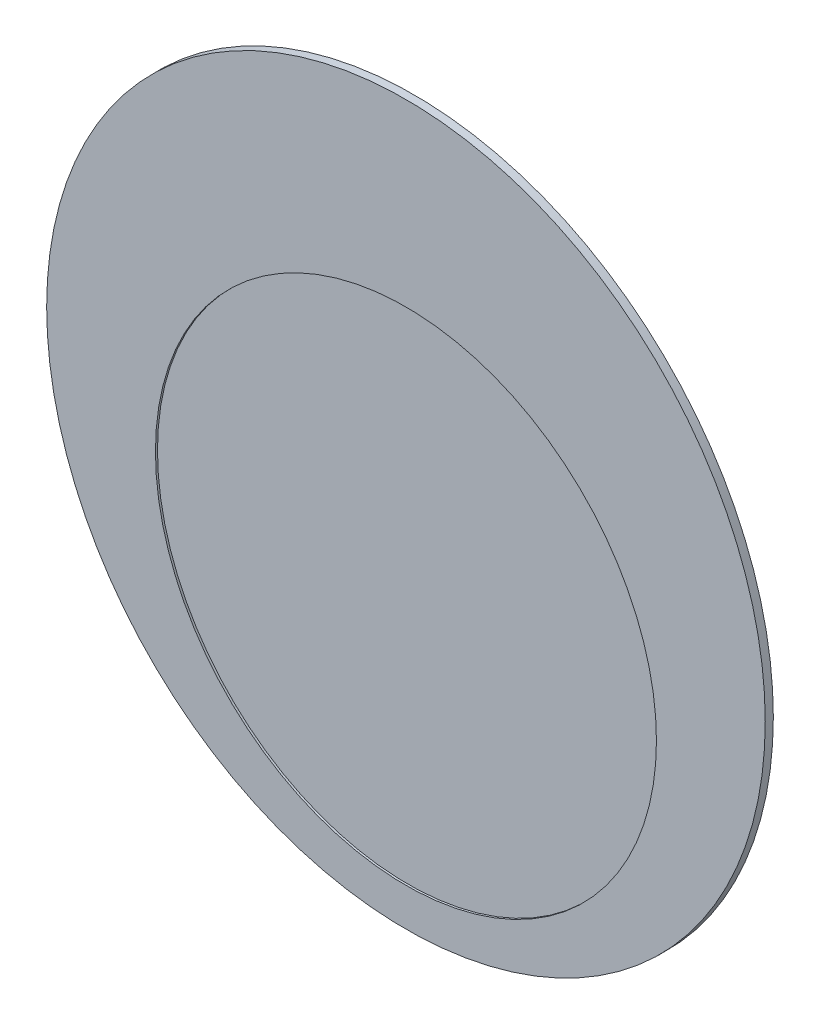
ISO-10303-21;
HEADER;
FILE_DESCRIPTION(('STEP AP214'),'2;1');
FILE_NAME('part.step','',(''),(''),'','','');
FILE_SCHEMA(('AUTOMOTIVE_DESIGN { 1 0 10303 214 1 1 1 1 }'));
ENDSEC;
DATA;
#1=APPLICATION_CONTEXT('core data for automotive mechanical design processes');
#2=APPLICATION_PROTOCOL_DEFINITION('international standard','automotive_design',2000,#1);
#3=PRODUCT_CONTEXT('',#1,'mechanical');
#4=PRODUCT('Part','Part','',(#3));
#5=PRODUCT_RELATED_PRODUCT_CATEGORY('part','',(#4));
#6=PRODUCT_DEFINITION_FORMATION('','',#4);
#7=PRODUCT_DEFINITION_CONTEXT('part definition',#1,'design');
#8=PRODUCT_DEFINITION('design','',#6,#7);
#9=PRODUCT_DEFINITION_SHAPE('','',#8);
#10=(LENGTH_UNIT() NAMED_UNIT(*) SI_UNIT(.MILLI.,.METRE.));
#11=(NAMED_UNIT(*) PLANE_ANGLE_UNIT() SI_UNIT($,.RADIAN.));
#12=(NAMED_UNIT(*) SI_UNIT($,.STERADIAN.) SOLID_ANGLE_UNIT());
#13=UNCERTAINTY_MEASURE_WITH_UNIT(LENGTH_MEASURE(1.E-05),#10,'distance_accuracy_value','');
#14=(GEOMETRIC_REPRESENTATION_CONTEXT(3) GLOBAL_UNCERTAINTY_ASSIGNED_CONTEXT((#13)) GLOBAL_UNIT_ASSIGNED_CONTEXT((#10,
#11,#12)) REPRESENTATION_CONTEXT('',''));
#15=CARTESIAN_POINT('',(0.,0.,0.));
#16=DIRECTION('',(0.,0.,1.));
#17=DIRECTION('',(1.,0.,0.));
#18=AXIS2_PLACEMENT_3D('',#15,#16,#17);
#19=CARTESIAN_POINT('',(0.,0.,0.8));
#20=DIRECTION('',(0.,0.,-1.));
#21=DIRECTION('',(-1.,0.,0.));
#22=AXIS2_PLACEMENT_3D('',#19,#20,#21);
#23=CYLINDRICAL_SURFACE('',#22,35.5);
#24=CARTESIAN_POINT('',(0.,0.,0.8));
#25=DIRECTION('',(0.,0.,1.));
#26=DIRECTION('',(1.,0.,0.));
#27=AXIS2_PLACEMENT_3D('',#24,#25,#26);
#28=CIRCLE('',#27,35.5);
#29=CARTESIAN_POINT('',(35.5,0.,0.8));
#30=VERTEX_POINT('',#29);
#31=EDGE_CURVE('E10',#30,#30,#28,.T.);
#32=ORIENTED_EDGE('',*,*,#31,.F.);
#33=EDGE_LOOP('',(#32));
#34=FACE_BOUND('',#33,.T.);
#35=CARTESIAN_POINT('',(0.,0.,0.));
#36=DIRECTION('',(0.,0.,1.));
#37=DIRECTION('',(1.,0.,0.));
#38=AXIS2_PLACEMENT_3D('',#35,#36,#37);
#39=CIRCLE('',#38,35.5);
#40=CARTESIAN_POINT('',(35.5,0.,0.));
#41=VERTEX_POINT('',#40);
#42=EDGE_CURVE('E40',#41,#41,#39,.T.);
#43=ORIENTED_EDGE('',*,*,#42,.T.);
#44=EDGE_LOOP('',(#43));
#45=FACE_BOUND('',#44,.T.);
#46=ADVANCED_FACE('F37',(#34,#45),#23,.T.);
#47=CARTESIAN_POINT('',(0.,0.,0.8));
#48=DIRECTION('',(0.,0.,1.));
#49=DIRECTION('',(1.,0.,0.));
#50=AXIS2_PLACEMENT_3D('',#47,#48,#49);
#51=PLANE('',#50);
#52=CARTESIAN_POINT('',(0.,-7.,0.8));
#53=DIRECTION('',(0.,0.,1.));
#54=DIRECTION('',(1.,0.,0.));
#55=AXIS2_PLACEMENT_3D('',#52,#53,#54);
#56=CIRCLE('',#55,24.75);
#57=CARTESIAN_POINT('',(24.75,-7.,0.8));
#58=VERTEX_POINT('',#57);
#59=EDGE_CURVE('E51',#58,#58,#56,.T.);
#60=ORIENTED_EDGE('',*,*,#59,.F.);
#61=EDGE_LOOP('',(#60));
#62=FACE_BOUND('',#61,.T.);
#63=ORIENTED_EDGE('',*,*,#31,.T.);
#64=EDGE_LOOP('',(#63));
#65=FACE_BOUND('',#64,.T.);
#66=ADVANCED_FACE('F68',(#62,#65),#51,.T.);
#67=CARTESIAN_POINT('',(0.,0.,0.));
#68=DIRECTION('',(0.,0.,1.));
#69=DIRECTION('',(1.,0.,0.));
#70=AXIS2_PLACEMENT_3D('',#67,#68,#69);
#71=PLANE('',#70);
#72=ORIENTED_EDGE('',*,*,#42,.F.);
#73=EDGE_LOOP('',(#72));
#74=FACE_BOUND('',#73,.T.);
#75=ADVANCED_FACE('F64',(#74),#71,.F.);
#76=CARTESIAN_POINT('',(0.,-7.,0.6));
#77=DIRECTION('',(0.,0.,1.));
#78=DIRECTION('',(1.,0.,0.));
#79=AXIS2_PLACEMENT_3D('',#76,#77,#78);
#80=CYLINDRICAL_SURFACE('',#79,24.75);
#81=CARTESIAN_POINT('',(0.,-7.,0.6));
#82=DIRECTION('',(0.,0.,1.));
#83=DIRECTION('',(1.,0.,0.));
#84=AXIS2_PLACEMENT_3D('',#81,#82,#83);
#85=CIRCLE('',#84,24.75);
#86=CARTESIAN_POINT('',(24.75,-7.,0.6));
#87=VERTEX_POINT('',#86);
#88=EDGE_CURVE('E49',#87,#87,#85,.T.);
#89=ORIENTED_EDGE('',*,*,#88,.F.);
#90=EDGE_LOOP('',(#89));
#91=FACE_BOUND('',#90,.T.);
#92=ORIENTED_EDGE('',*,*,#59,.T.);
#93=EDGE_LOOP('',(#92));
#94=FACE_BOUND('',#93,.T.);
#95=ADVANCED_FACE('F61',(#91,#94),#80,.F.);
#96=CARTESIAN_POINT('',(0.,-7.,0.6));
#97=DIRECTION('',(0.,0.,1.));
#98=DIRECTION('',(1.,0.,0.));
#99=AXIS2_PLACEMENT_3D('',#96,#97,#98);
#100=PLANE('',#99);
#101=ORIENTED_EDGE('',*,*,#88,.T.);
#102=EDGE_LOOP('',(#101));
#103=FACE_BOUND('',#102,.T.);
#104=ADVANCED_FACE('F59',(#103),#100,.T.);
#105=CLOSED_SHELL('',(#46,#66,#75,#95,#104));
#106=MANIFOLD_SOLID_BREP('B2',#105);
#107=ADVANCED_BREP_SHAPE_REPRESENTATION('',(#18,#106),#14);
#108=SHAPE_DEFINITION_REPRESENTATION(#9,#107);
ENDSEC;
END-ISO-10303-21;
